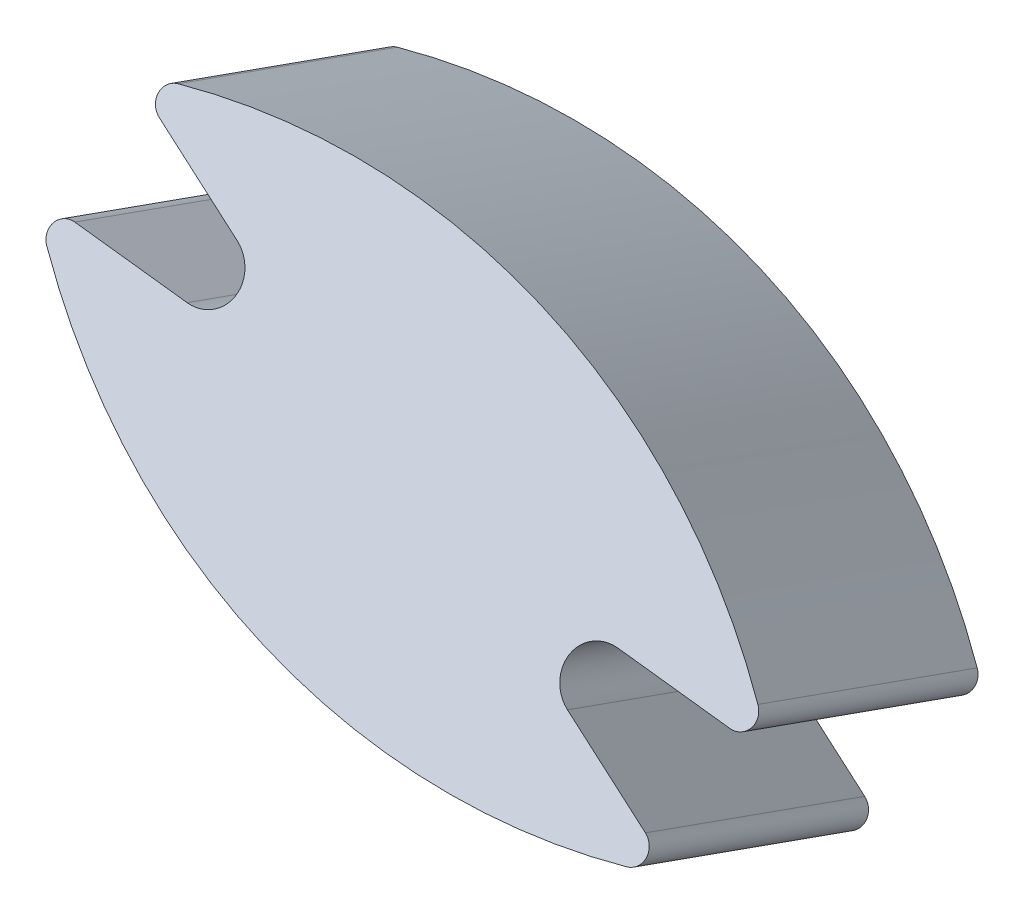
ISO-10303-21;
HEADER;
FILE_DESCRIPTION(('STEP AP214'),'2;1');
FILE_NAME('part.step','',(''),(''),'','','');
FILE_SCHEMA(('AUTOMOTIVE_DESIGN { 1 0 10303 214 1 1 1 1 }'));
ENDSEC;
DATA;
#1=APPLICATION_CONTEXT('core data for automotive mechanical design processes');
#2=APPLICATION_PROTOCOL_DEFINITION('international standard','automotive_design',2000,#1);
#3=PRODUCT_CONTEXT('',#1,'mechanical');
#4=PRODUCT('Part','Part','',(#3));
#5=PRODUCT_RELATED_PRODUCT_CATEGORY('part','',(#4));
#6=PRODUCT_DEFINITION_FORMATION('','',#4);
#7=PRODUCT_DEFINITION_CONTEXT('part definition',#1,'design');
#8=PRODUCT_DEFINITION('design','',#6,#7);
#9=PRODUCT_DEFINITION_SHAPE('','',#8);
#10=(LENGTH_UNIT() NAMED_UNIT(*) SI_UNIT(.MILLI.,.METRE.));
#11=(NAMED_UNIT(*) PLANE_ANGLE_UNIT() SI_UNIT($,.RADIAN.));
#12=(NAMED_UNIT(*) SI_UNIT($,.STERADIAN.) SOLID_ANGLE_UNIT());
#13=UNCERTAINTY_MEASURE_WITH_UNIT(LENGTH_MEASURE(1.E-05),#10,'distance_accuracy_value','');
#14=(GEOMETRIC_REPRESENTATION_CONTEXT(3) GLOBAL_UNCERTAINTY_ASSIGNED_CONTEXT((#13)) GLOBAL_UNIT_ASSIGNED_CONTEXT((#10,
#11,#12)) REPRESENTATION_CONTEXT('',''));
#15=CARTESIAN_POINT('',(0.,0.,0.));
#16=DIRECTION('',(0.,0.,1.));
#17=DIRECTION('',(1.,0.,0.));
#18=AXIS2_PLACEMENT_3D('',#15,#16,#17);
#19=CARTESIAN_POINT('',(31.8711340845072,28.281444521324,-5.52041871375051));
#20=DIRECTION('',(-0.155936913873109,-0.874020190104156,0.460187338137444));
#21=DIRECTION('',(0.,-0.465886520251034,-0.88484447800073));
#22=AXIS2_PLACEMENT_3D('',#19,#20,#21);
#23=PLANE('',#22);
#24=DIRECTION('',(0.970591739146291,-0.222082223103027,-0.0929040477191182));
#25=VECTOR('',#24,1.);
#26=CARTESIAN_POINT('',(31.8711340845072,28.281444521324,-5.52041871375051));
#27=LINE('',#26,#25);
#28=CARTESIAN_POINT('',(31.8711340845071,28.2814445213241,-5.52041871375051));
#29=VERTEX_POINT('',#28);
#30=CARTESIAN_POINT('',(32.7011124052281,28.0915362178028,-5.5998633889977));
#31=VERTEX_POINT('',#30);
#32=EDGE_CURVE('E136',#29,#31,#27,.T.);
#33=ORIENTED_EDGE('',*,*,#32,.T.);
#34=DIRECTION('',(0.183399440546355,0.432166858368284,0.882947592858926));
#35=VECTOR('',#34,1.);
#36=CARTESIAN_POINT('',(32.701112405228,28.0915362178028,-5.59986338899772));
#37=LINE('',#36,#35);
#38=CARTESIAN_POINT('',(33.1669469842158,29.1892400380582,-3.35717650313605));
#39=VERTEX_POINT('',#38);
#40=EDGE_CURVE('E126',#39,#31,#37,.F.);
#41=ORIENTED_EDGE('',*,*,#40,.F.);
#42=DIRECTION('',(-0.970591739146285,0.222082223103041,0.0929040477191451));
#43=VECTOR('',#42,1.);
#44=CARTESIAN_POINT('',(33.1669469842158,29.1892400380582,-3.35717650313605));
#45=LINE('',#44,#43);
#46=CARTESIAN_POINT('',(32.3369686634949,29.3791483415795,-3.27773182788883));
#47=VERTEX_POINT('',#46);
#48=EDGE_CURVE('E198',#39,#47,#45,.T.);
#49=ORIENTED_EDGE('',*,*,#48,.T.);
#50=DIRECTION('',(0.183399440546356,0.432166858368284,0.882947592858926));
#51=VECTOR('',#50,1.);
#52=CARTESIAN_POINT('',(31.8711340845072,28.2814445213241,-5.52041871375052));
#53=LINE('',#52,#51);
#54=EDGE_CURVE('E129',#47,#29,#53,.F.);
#55=ORIENTED_EDGE('',*,*,#54,.T.);
#56=EDGE_LOOP('',(#33,#41,#49,#55));
#57=FACE_BOUND('',#56,.T.);
#58=ADVANCED_FACE('F17',(#57),#23,.T.);
#59=CARTESIAN_POINT('',(28.7862023165263,29.5954503799583,-5.52279147454527));
#60=DIRECTION('',(-0.522781091591589,-0.717765389355844,0.459905181659395));
#61=DIRECTION('',(0.808323458037511,-0.588738640812951,0.));
#62=AXIS2_PLACEMENT_3D('',#59,#60,#61);
#63=PLANE('',#62);
#64=DIRECTION('',(0.832505000274226,-0.54593465943366,0.0942908911160763));
#65=VECTOR('',#64,1.);
#66=CARTESIAN_POINT('',(28.0743055691595,30.0622933517094,-5.60342207576658));
#67=LINE('',#66,#65);
#68=CARTESIAN_POINT('',(28.0743055691595,30.0622933517094,-5.60342207576657));
#69=VERTEX_POINT('',#68);
#70=CARTESIAN_POINT('',(28.7862023165263,29.5954503799584,-5.52279147454527));
#71=VERTEX_POINT('',#70);
#72=EDGE_CURVE('E125',#69,#71,#67,.T.);
#73=ORIENTED_EDGE('',*,*,#72,.T.);
#74=DIRECTION('',(0.183399440546341,0.43216685836829,0.882947592858926));
#75=VECTOR('',#74,1.);
#76=CARTESIAN_POINT('',(28.7862023165263,29.5954503799583,-5.52279147454527));
#77=LINE('',#76,#75);
#78=CARTESIAN_POINT('',(29.2520368955141,30.6931542002138,-3.28010458868359));
#79=VERTEX_POINT('',#78);
#80=EDGE_CURVE('E109',#71,#79,#77,.T.);
#81=ORIENTED_EDGE('',*,*,#80,.T.);
#82=DIRECTION('',(-0.832505000274225,0.545934659433664,-0.0942908911160685));
#83=VECTOR('',#82,1.);
#84=CARTESIAN_POINT('',(29.2520368955141,30.6931542002138,-3.28010458868359));
#85=LINE('',#84,#83);
#86=CARTESIAN_POINT('',(28.5401401481472,31.1599971719649,-3.36073518990489));
#87=VERTEX_POINT('',#86);
#88=EDGE_CURVE('E118',#79,#87,#85,.T.);
#89=ORIENTED_EDGE('',*,*,#88,.T.);
#90=DIRECTION('',(0.18339944054635,0.432166858368286,0.882947592858926));
#91=VECTOR('',#90,1.);
#92=CARTESIAN_POINT('',(28.0743055691595,30.0622933517094,-5.60342207576658));
#93=LINE('',#92,#91);
#94=EDGE_CURVE('E166',#69,#87,#93,.T.);
#95=ORIENTED_EDGE('',*,*,#94,.F.);
#96=EDGE_LOOP('',(#73,#81,#89,#95));
#97=FACE_BOUND('',#96,.T.);
#98=ADVANCED_FACE('F128',(#97),#63,.T.);
#99=CARTESIAN_POINT('',(31.8315261083834,28.0594433930376,-5.4035311298636));
#100=DIRECTION('',(0.183399440546356,0.432166858368284,0.882947592858926));
#101=DIRECTION('',(0.,-0.898182130665289,0.439623543675224));
#102=AXIS2_PLACEMENT_3D('',#99,#100,#101);
#103=CYLINDRICAL_SURFACE('',#102,0.254000000000002);
#104=DIRECTION('',(0.183399440546356,0.43216685836828,0.882947592858928));
#105=VECTOR('',#104,1.);
#106=CARTESIAN_POINT('',(31.6987397111191,27.8771309841412,-5.28671521372211));
#107=LINE('',#106,#105);
#108=CARTESIAN_POINT('',(31.6987397111191,27.8771309841412,-5.28671521372211));
#109=VERTEX_POINT('',#108);
#110=CARTESIAN_POINT('',(32.1645742901068,28.9748348043966,-3.04402832786043));
#111=VERTEX_POINT('',#110);
#112=EDGE_CURVE('E185',#109,#111,#107,.T.);
#113=ORIENTED_EDGE('',*,*,#112,.F.);
#114=CARTESIAN_POINT('',(31.8315261083834,28.0594433930376,-5.4035311298636));
#115=DIRECTION('',(0.183399440546356,0.432166858368284,0.882947592858926));
#116=DIRECTION('',(0.,-0.898182130665289,0.439623543675224));
#117=AXIS2_PLACEMENT_3D('',#114,#115,#116);
#118=CIRCLE('',#117,0.254000000000002);
#119=EDGE_CURVE('E20',#29,#109,#118,.T.);
#120=ORIENTED_EDGE('',*,*,#119,.F.);
#121=ORIENTED_EDGE('',*,*,#54,.F.);
#122=CARTESIAN_POINT('',(32.2973606873711,29.157147213293,-3.16084424400192));
#123=DIRECTION('',(0.183399440546356,0.432166858368284,0.882947592858926));
#124=DIRECTION('',(0.,-0.898182130665289,0.439623543675224));
#125=AXIS2_PLACEMENT_3D('',#122,#123,#124);
#126=CIRCLE('',#125,0.254000000000002);
#127=EDGE_CURVE('E115',#111,#47,#126,.F.);
#128=ORIENTED_EDGE('',*,*,#127,.F.);
#129=EDGE_LOOP('',(#113,#120,#121,#128));
#130=FACE_BOUND('',#129,.T.);
#131=ADVANCED_FACE('F186',(#130),#103,.F.);
#132=CARTESIAN_POINT('',(28.653415919262,29.413137971062,-5.40597555840379));
#133=DIRECTION('',(0.183399440546358,0.432166858368283,0.882947592858926));
#134=DIRECTION('',(0.,-0.89818213066529,0.439623543675222));
#135=AXIS2_PLACEMENT_3D('',#132,#133,#134);
#136=CYLINDRICAL_SURFACE('',#135,0.253999999999999);
#137=CARTESIAN_POINT('',(28.653415919262,29.413137971062,-5.40597555840379));
#138=DIRECTION('',(0.183399440546358,0.432166858368283,0.882947592858926));
#139=DIRECTION('',(0.,-0.89818213066529,0.439623543675222));
#140=AXIS2_PLACEMENT_3D('',#137,#138,#139);
#141=CIRCLE('',#140,0.253999999999999);
#142=CARTESIAN_POINT('',(28.6138079431383,29.1911368427755,-5.28908797451688));
#143=VERTEX_POINT('',#142);
#144=EDGE_CURVE('E100',#143,#71,#141,.T.);
#145=ORIENTED_EDGE('',*,*,#144,.F.);
#146=DIRECTION('',(-0.183399440546362,-0.432166858368279,-0.882947592858927));
#147=VECTOR('',#146,1.);
#148=CARTESIAN_POINT('',(29.0796425221261,30.288840663031,-3.04640108865521));
#149=LINE('',#148,#147);
#150=CARTESIAN_POINT('',(29.079642522126,30.288840663031,-3.04640108865518));
#151=VERTEX_POINT('',#150);
#152=EDGE_CURVE('E112',#151,#143,#149,.T.);
#153=ORIENTED_EDGE('',*,*,#152,.F.);
#154=CARTESIAN_POINT('',(29.1192504982498,30.5108417913174,-3.1632886725421));
#155=DIRECTION('',(0.183399440546358,0.432166858368283,0.882947592858926));
#156=DIRECTION('',(0.,-0.89818213066529,0.439623543675222));
#157=AXIS2_PLACEMENT_3D('',#154,#155,#156);
#158=CIRCLE('',#157,0.253999999999999);
#159=EDGE_CURVE('E105',#79,#151,#158,.F.);
#160=ORIENTED_EDGE('',*,*,#159,.F.);
#161=ORIENTED_EDGE('',*,*,#80,.F.);
#162=EDGE_LOOP('',(#145,#153,#160,#161));
#163=FACE_BOUND('',#162,.T.);
#164=ADVANCED_FACE('F107',(#163),#136,.F.);
#165=CARTESIAN_POINT('',(32.72091639329,28.202536781946,-5.65830718094118));
#166=DIRECTION('',(0.183399440546355,0.432166858368284,0.882947592858926));
#167=DIRECTION('',(0.,-0.898182130665289,0.439623543675224));
#168=AXIS2_PLACEMENT_3D('',#165,#166,#167);
#169=CYLINDRICAL_SURFACE('',#168,0.126999999999997);
#170=DIRECTION('',(0.183399440546356,0.432166858368284,0.882947592858926));
#171=VECTOR('',#170,1.);
#172=CARTESIAN_POINT('',(32.8193946419805,28.2645726107914,-5.7091263748969));
#173=LINE('',#172,#171);
#174=CARTESIAN_POINT('',(33.2852292209682,29.3622764310468,-3.46643948903519));
#175=VERTEX_POINT('',#174);
#176=CARTESIAN_POINT('',(32.8193946419805,28.2645726107914,-5.70912637489687));
#177=VERTEX_POINT('',#176);
#178=EDGE_CURVE('E205',#175,#177,#173,.F.);
#179=ORIENTED_EDGE('',*,*,#178,.F.);
#180=CARTESIAN_POINT('',(33.1867509722777,29.3002406022014,-3.41562029507949));
#181=DIRECTION('',(0.183399440546355,0.432166858368284,0.882947592858926));
#182=DIRECTION('',(0.,-0.898182130665289,0.439623543675224));
#183=AXIS2_PLACEMENT_3D('',#180,#181,#182);
#184=CIRCLE('',#183,0.126999999999997);
#185=EDGE_CURVE('E168',#175,#39,#184,.F.);
#186=ORIENTED_EDGE('',*,*,#185,.T.);
#187=ORIENTED_EDGE('',*,*,#40,.T.);
#188=CARTESIAN_POINT('',(32.72091639329,28.202536781946,-5.65830718094118));
#189=DIRECTION('',(0.183399440546355,0.432166858368284,0.882947592858926));
#190=DIRECTION('',(0.,-0.898182130665289,0.439623543675224));
#191=AXIS2_PLACEMENT_3D('',#188,#189,#190);
#192=CIRCLE('',#191,0.126999999999997);
#193=EDGE_CURVE('E170',#31,#177,#192,.T.);
#194=ORIENTED_EDGE('',*,*,#193,.T.);
#195=EDGE_LOOP('',(#179,#186,#187,#194));
#196=FACE_BOUND('',#195,.T.);
#197=ADVANCED_FACE('F203',(#196),#169,.T.);
#198=CARTESIAN_POINT('',(28.1406987677917,30.1534495561576,-5.66183003383732));
#199=DIRECTION('',(0.18339944054635,0.432166858368286,0.882947592858926));
#200=DIRECTION('',(0.,-0.898182130665288,0.439623543675225));
#201=AXIS2_PLACEMENT_3D('',#198,#199,#200);
#202=CYLINDRICAL_SURFACE('',#201,0.127);
#203=CARTESIAN_POINT('',(28.1406987677917,30.1534495561576,-5.6618300338373));
#204=DIRECTION('',(0.18339944054635,0.432166858368286,0.882947592858926));
#205=DIRECTION('',(0.,-0.898182130665288,0.439623543675225));
#206=AXIS2_PLACEMENT_3D('',#203,#204,#205);
#207=CIRCLE('',#206,0.127);
#208=CARTESIAN_POINT('',(28.1172645442852,30.2674131794425,-5.71274299619898));
#209=VERTEX_POINT('',#208);
#210=EDGE_CURVE('E163',#209,#69,#207,.T.);
#211=ORIENTED_EDGE('',*,*,#210,.T.);
#212=ORIENTED_EDGE('',*,*,#94,.T.);
#213=CARTESIAN_POINT('',(28.6065333467794,31.2511533764131,-3.41914314797563));
#214=DIRECTION('',(0.18339944054635,0.432166858368286,0.882947592858926));
#215=DIRECTION('',(0.,-0.898182130665288,0.439623543675225));
#216=AXIS2_PLACEMENT_3D('',#213,#214,#215);
#217=CIRCLE('',#216,0.127);
#218=CARTESIAN_POINT('',(28.5830991232729,31.3651169996979,-3.47005611033731));
#219=VERTEX_POINT('',#218);
#220=EDGE_CURVE('E121',#87,#219,#217,.F.);
#221=ORIENTED_EDGE('',*,*,#220,.T.);
#222=DIRECTION('',(0.183399440546356,0.432166858368284,0.882947592858926));
#223=VECTOR('',#222,1.);
#224=CARTESIAN_POINT('',(28.1172645442852,30.2674131794425,-5.71274299619902));
#225=LINE('',#224,#223);
#226=EDGE_CURVE('E212',#209,#219,#225,.T.);
#227=ORIENTED_EDGE('',*,*,#226,.F.);
#228=EDGE_LOOP('',(#211,#212,#221,#227));
#229=FACE_BOUND('',#228,.T.);
#230=ADVANCED_FACE('F255',(#229),#202,.T.);
#231=CARTESIAN_POINT('',(31.6987397111191,27.8771309841412,-5.28671521372211));
#232=DIRECTION('',(0.522781091591589,0.717765389355843,-0.459905181659395));
#233=DIRECTION('',(-0.80832345803751,0.588738640812951,0.));
#234=AXIS2_PLACEMENT_3D('',#231,#232,#233);
#235=PLANE('',#234);
#236=DIRECTION('',(-0.832505000274228,0.545934659433656,-0.0942908911160844));
#237=VECTOR('',#236,1.);
#238=CARTESIAN_POINT('',(32.4106364584859,27.4102880123901,-5.2060846125008));
#239=LINE('',#238,#237);
#240=CARTESIAN_POINT('',(32.4106364584859,27.4102880123901,-5.2060846125008));
#241=VERTEX_POINT('',#240);
#242=EDGE_CURVE('E180',#241,#109,#239,.T.);
#243=ORIENTED_EDGE('',*,*,#242,.T.);
#244=ORIENTED_EDGE('',*,*,#112,.T.);
#245=DIRECTION('',(0.832505000274227,-0.545934659433658,0.0942908911160841));
#246=VECTOR('',#245,1.);
#247=CARTESIAN_POINT('',(32.1645742901068,28.9748348043966,-3.04402832786043));
#248=LINE('',#247,#246);
#249=CARTESIAN_POINT('',(32.8764710374737,28.5079918326456,-2.96339772663911));
#250=VERTEX_POINT('',#249);
#251=EDGE_CURVE('E192',#111,#250,#248,.T.);
#252=ORIENTED_EDGE('',*,*,#251,.T.);
#253=DIRECTION('',(0.183399440546355,0.432166858368284,0.882947592858926));
#254=VECTOR('',#253,1.);
#255=CARTESIAN_POINT('',(32.4106364584859,27.4102880123901,-5.2060846125008));
#256=LINE('',#255,#254);
#257=EDGE_CURVE('E162',#241,#250,#256,.T.);
#258=ORIENTED_EDGE('',*,*,#257,.F.);
#259=EDGE_LOOP('',(#243,#244,#252,#258));
#260=FACE_BOUND('',#259,.T.);
#261=ADVANCED_FACE('F190',(#260),#235,.T.);
#262=CARTESIAN_POINT('',(28.6138079431383,29.1911368427755,-5.28908797451688));
#263=DIRECTION('',(0.15593691387311,0.874020190104155,-0.460187338137444));
#264=DIRECTION('',(0.,0.465886520251034,0.884844478000729));
#265=AXIS2_PLACEMENT_3D('',#262,#263,#264);
#266=PLANE('',#265);
#267=DIRECTION('',(-0.970591739146286,0.222082223103038,0.0929040477191378));
#268=VECTOR('',#267,1.);
#269=CARTESIAN_POINT('',(28.6138079431383,29.1911368427755,-5.28908797451688));
#270=LINE('',#269,#268);
#271=CARTESIAN_POINT('',(27.7838296224174,29.3810451462968,-5.20964329926966));
#272=VERTEX_POINT('',#271);
#273=EDGE_CURVE('E216',#143,#272,#270,.T.);
#274=ORIENTED_EDGE('',*,*,#273,.T.);
#275=DIRECTION('',(0.18339944054635,0.432166858368286,0.882947592858926));
#276=VECTOR('',#275,1.);
#277=CARTESIAN_POINT('',(27.7838296224174,29.3810451462968,-5.20964329926966));
#278=LINE('',#277,#276);
#279=CARTESIAN_POINT('',(28.2496642014051,30.4787489665522,-2.96695641340798));
#280=VERTEX_POINT('',#279);
#281=EDGE_CURVE('E155',#280,#272,#278,.F.);
#282=ORIENTED_EDGE('',*,*,#281,.F.);
#283=DIRECTION('',(-0.97059173914628,0.222082223103073,0.0929040477191149));
#284=VECTOR('',#283,1.);
#285=CARTESIAN_POINT('',(29.0796425221261,30.288840663031,-3.04640108865518));
#286=LINE('',#285,#284);
#287=EDGE_CURVE('E159',#151,#280,#286,.T.);
#288=ORIENTED_EDGE('',*,*,#287,.F.);
#289=ORIENTED_EDGE('',*,*,#152,.T.);
#290=EDGE_LOOP('',(#274,#282,#288,#289));
#291=FACE_BOUND('',#290,.T.);
#292=ADVANCED_FACE('F222',(#291),#266,.T.);
#293=CARTESIAN_POINT('',(29.0211160180517,25.8718679703837,-3.74904421813805));
#294=DIRECTION('',(0.183399440546356,0.432166858368284,0.882947592858926));
#295=DIRECTION('',(0.,-0.898182130665289,0.439623543675223));
#296=AXIS2_PLACEMENT_3D('',#293,#294,#295);
#297=CYLINDRICAL_SURFACE('',#296,4.89835462808358);
#298=CARTESIAN_POINT('',(29.0211160180517,25.8718679703837,-3.74904421813803));
#299=DIRECTION('',(0.183399440546356,0.432166858368284,0.882947592858926));
#300=DIRECTION('',(0.,-0.898182130665289,0.439623543675223));
#301=AXIS2_PLACEMENT_3D('',#298,#299,#300);
#302=CIRCLE('',#301,4.89835462808358);
#303=EDGE_CURVE('E152',#177,#209,#302,.T.);
#304=ORIENTED_EDGE('',*,*,#303,.T.);
#305=ORIENTED_EDGE('',*,*,#226,.T.);
#306=CARTESIAN_POINT('',(29.4869505970394,26.9695717906391,-1.50635733227635));
#307=DIRECTION('',(0.183399440546356,0.432166858368284,0.882947592858926));
#308=DIRECTION('',(0.,-0.898182130665289,0.439623543675223));
#309=AXIS2_PLACEMENT_3D('',#306,#307,#308);
#310=CIRCLE('',#309,4.89835462808358);
#311=EDGE_CURVE('E160',#175,#219,#310,.T.);
#312=ORIENTED_EDGE('',*,*,#311,.F.);
#313=ORIENTED_EDGE('',*,*,#178,.T.);
#314=EDGE_LOOP('',(#304,#305,#312,#313));
#315=FACE_BOUND('',#314,.T.);
#316=ADVANCED_FACE('F209',(#315),#297,.T.);
#317=CARTESIAN_POINT('',(32.2973606873711,29.1571472132931,-3.16084424400192));
#318=DIRECTION('',(0.183399440546356,0.432166858368284,0.882947592858926));
#319=DIRECTION('',(0.,-0.898182130665289,0.439623543675223));
#320=AXIS2_PLACEMENT_3D('',#317,#318,#319);
#321=PLANE('',#320);
#322=CARTESIAN_POINT('',(32.8100778388415,28.4168356281974,-2.90498976856838));
#323=DIRECTION('',(0.183399440546355,0.432166858368284,0.882947592858926));
#324=DIRECTION('',(0.,-0.898182130665289,0.439623543675224));
#325=AXIS2_PLACEMENT_3D('',#322,#323,#324);
#326=CIRCLE('',#325,0.126999999999997);
#327=CARTESIAN_POINT('',(32.833512062348,28.3028720049125,-2.8540768062067));
#328=VERTEX_POINT('',#327);
#329=EDGE_CURVE('E146',#250,#328,#326,.F.);
#330=ORIENTED_EDGE('',*,*,#329,.F.);
#331=ORIENTED_EDGE('',*,*,#251,.F.);
#332=ORIENTED_EDGE('',*,*,#127,.T.);
#333=ORIENTED_EDGE('',*,*,#48,.F.);
#334=ORIENTED_EDGE('',*,*,#185,.F.);
#335=ORIENTED_EDGE('',*,*,#311,.T.);
#336=ORIENTED_EDGE('',*,*,#220,.F.);
#337=ORIENTED_EDGE('',*,*,#88,.F.);
#338=ORIENTED_EDGE('',*,*,#159,.T.);
#339=ORIENTED_EDGE('',*,*,#287,.T.);
#340=CARTESIAN_POINT('',(28.2298602133432,30.367748402409,-2.90851262146452));
#341=DIRECTION('',(0.18339944054635,0.432166858368286,0.882947592858926));
#342=DIRECTION('',(0.,-0.898182130665288,0.439623543675225));
#343=AXIS2_PLACEMENT_3D('',#340,#341,#342);
#344=CIRCLE('',#343,0.127);
#345=CARTESIAN_POINT('',(28.1313819646527,30.3057125735636,-2.85769342750883));
#346=VERTEX_POINT('',#345);
#347=EDGE_CURVE('E156',#346,#280,#344,.F.);
#348=ORIENTED_EDGE('',*,*,#347,.F.);
#349=CARTESIAN_POINT('',(31.9296605885815,32.6984172139713,-4.81777558426766));
#350=DIRECTION('',(0.183399440546356,0.432166858368284,0.882947592858926));
#351=DIRECTION('',(0.,-0.898182130665289,0.439623543675223));
#352=AXIS2_PLACEMENT_3D('',#349,#350,#351);
#353=CIRCLE('',#352,4.89835462808358);
#354=EDGE_CURVE('E143',#328,#346,#353,.F.);
#355=ORIENTED_EDGE('',*,*,#354,.F.);
#356=EDGE_LOOP('',(#330,#331,#332,#333,#334,#335,#336,#337,#338,#339,#348,#355));
#357=FACE_BOUND('',#356,.T.);
#358=ADVANCED_FACE('F119',(#357),#321,.T.);
#359=CARTESIAN_POINT('',(27.7640256343555,29.2700445821535,-5.1511995073262));
#360=DIRECTION('',(0.18339944054635,0.432166858368286,0.882947592858926));
#361=DIRECTION('',(0.,-0.898182130665288,0.439623543675225));
#362=AXIS2_PLACEMENT_3D('',#359,#360,#361);
#363=CYLINDRICAL_SURFACE('',#362,0.127);
#364=CARTESIAN_POINT('',(27.7640256343555,29.2700445821536,-5.15119950732619));
#365=DIRECTION('',(0.18339944054635,0.432166858368286,0.882947592858926));
#366=DIRECTION('',(0.,-0.898182130665288,0.439623543675225));
#367=AXIS2_PLACEMENT_3D('',#364,#365,#366);
#368=CIRCLE('',#367,0.127);
#369=CARTESIAN_POINT('',(27.6655473856649,29.2080087533082,-5.1003803133705));
#370=VERTEX_POINT('',#369);
#371=EDGE_CURVE('E150',#272,#370,#368,.T.);
#372=ORIENTED_EDGE('',*,*,#371,.T.);
#373=DIRECTION('',(0.183399440546356,0.432166858368284,0.882947592858926));
#374=VECTOR('',#373,1.);
#375=CARTESIAN_POINT('',(27.6655473856649,29.2080087533082,-5.10038031337051));
#376=LINE('',#375,#374);
#377=EDGE_CURVE('E142',#346,#370,#376,.F.);
#378=ORIENTED_EDGE('',*,*,#377,.F.);
#379=ORIENTED_EDGE('',*,*,#347,.T.);
#380=ORIENTED_EDGE('',*,*,#281,.T.);
#381=EDGE_LOOP('',(#372,#378,#379,#380));
#382=FACE_BOUND('',#381,.T.);
#383=ADVANCED_FACE('F227',(#382),#363,.T.);
#384=CARTESIAN_POINT('',(31.8315261083834,28.0594433930376,-5.4035311298636));
#385=DIRECTION('',(0.183399440546356,0.432166858368284,0.882947592858926));
#386=DIRECTION('',(0.,-0.898182130665289,0.439623543675223));
#387=AXIS2_PLACEMENT_3D('',#384,#385,#386);
#388=PLANE('',#387);
#389=ORIENTED_EDGE('',*,*,#242,.F.);
#390=CARTESIAN_POINT('',(32.3442432598538,27.3191318079419,-5.14767665443008));
#391=DIRECTION('',(0.183399440546355,0.432166858368284,0.882947592858926));
#392=DIRECTION('',(0.,-0.898182130665289,0.439623543675224));
#393=AXIS2_PLACEMENT_3D('',#390,#391,#392);
#394=CIRCLE('',#393,0.126999999999997);
#395=CARTESIAN_POINT('',(32.3676774833603,27.2051681846571,-5.09676369206839));
#396=VERTEX_POINT('',#395);
#397=EDGE_CURVE('E35',#396,#241,#394,.T.);
#398=ORIENTED_EDGE('',*,*,#397,.F.);
#399=CARTESIAN_POINT('',(31.4638260095938,31.6007133937159,-7.06046247012934));
#400=DIRECTION('',(0.183399440546356,0.432166858368284,0.882947592858926));
#401=DIRECTION('',(0.,-0.898182130665289,0.439623543675223));
#402=AXIS2_PLACEMENT_3D('',#399,#400,#401);
#403=CIRCLE('',#402,4.89835462808358);
#404=EDGE_CURVE('E26',#370,#396,#403,.T.);
#405=ORIENTED_EDGE('',*,*,#404,.F.);
#406=ORIENTED_EDGE('',*,*,#371,.F.);
#407=ORIENTED_EDGE('',*,*,#273,.F.);
#408=ORIENTED_EDGE('',*,*,#144,.T.);
#409=ORIENTED_EDGE('',*,*,#72,.F.);
#410=ORIENTED_EDGE('',*,*,#210,.F.);
#411=ORIENTED_EDGE('',*,*,#303,.F.);
#412=ORIENTED_EDGE('',*,*,#193,.F.);
#413=ORIENTED_EDGE('',*,*,#32,.F.);
#414=ORIENTED_EDGE('',*,*,#119,.T.);
#415=EDGE_LOOP('',(#389,#398,#405,#406,#407,#408,#409,#410,#411,#412,#413,#414));
#416=FACE_BOUND('',#415,.T.);
#417=ADVANCED_FACE('F178',(#416),#388,.F.);
#418=CARTESIAN_POINT('',(32.3442432598538,27.319131807942,-5.14767665443006));
#419=DIRECTION('',(0.183399440546355,0.432166858368284,0.882947592858926));
#420=DIRECTION('',(0.,-0.898182130665289,0.439623543675224));
#421=AXIS2_PLACEMENT_3D('',#418,#419,#420);
#422=CYLINDRICAL_SURFACE('',#421,0.126999999999997);
#423=ORIENTED_EDGE('',*,*,#329,.T.);
#424=DIRECTION('',(0.183399440546356,0.432166858368284,0.882947592858926));
#425=VECTOR('',#424,1.);
#426=CARTESIAN_POINT('',(32.3676774833603,27.2051681846571,-5.09676369206838));
#427=LINE('',#426,#425);
#428=EDGE_CURVE('E11',#396,#328,#427,.T.);
#429=ORIENTED_EDGE('',*,*,#428,.F.);
#430=ORIENTED_EDGE('',*,*,#397,.T.);
#431=ORIENTED_EDGE('',*,*,#257,.T.);
#432=EDGE_LOOP('',(#423,#429,#430,#431));
#433=FACE_BOUND('',#432,.T.);
#434=ADVANCED_FACE('F234',(#433),#422,.T.);
#435=CARTESIAN_POINT('',(31.4638260095938,31.6007133937159,-7.06046247012934));
#436=DIRECTION('',(0.183399440546356,0.432166858368284,0.882947592858926));
#437=DIRECTION('',(0.,-0.898182130665289,0.439623543675223));
#438=AXIS2_PLACEMENT_3D('',#435,#436,#437);
#439=CYLINDRICAL_SURFACE('',#438,4.89835462808358);
#440=ORIENTED_EDGE('',*,*,#404,.T.);
#441=ORIENTED_EDGE('',*,*,#428,.T.);
#442=ORIENTED_EDGE('',*,*,#354,.T.);
#443=ORIENTED_EDGE('',*,*,#377,.T.);
#444=EDGE_LOOP('',(#440,#441,#442,#443));
#445=FACE_BOUND('',#444,.T.);
#446=ADVANCED_FACE('F231',(#445),#439,.T.);
#447=CLOSED_SHELL('',(#58,#98,#131,#164,#197,#230,#261,#292,#316,#358,#383,#417,#434,#446));
#448=MANIFOLD_SOLID_BREP('B1',#447);
#449=ADVANCED_BREP_SHAPE_REPRESENTATION('',(#18,#448),#14);
#450=SHAPE_DEFINITION_REPRESENTATION(#9,#449);
ENDSEC;
END-ISO-10303-21;
